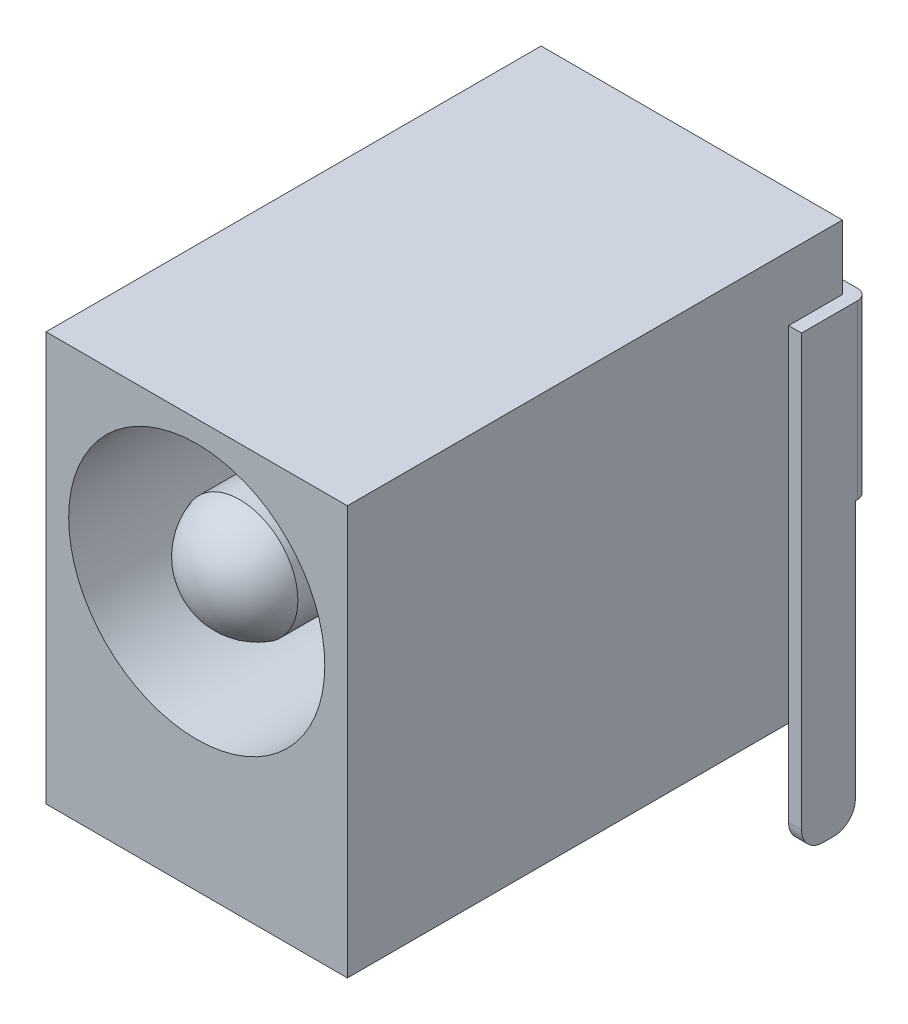
ISO-10303-21;
HEADER;
FILE_DESCRIPTION(('STEP AP214'),'2;1');
FILE_NAME('part.step','',(''),(''),'','','');
FILE_SCHEMA(('AUTOMOTIVE_DESIGN { 1 0 10303 214 1 1 1 1 }'));
ENDSEC;
DATA;
#1=APPLICATION_CONTEXT('core data for automotive mechanical design processes');
#2=APPLICATION_PROTOCOL_DEFINITION('international standard','automotive_design',2000,#1);
#3=PRODUCT_CONTEXT('',#1,'mechanical');
#4=PRODUCT('Part','Part','',(#3));
#5=PRODUCT_RELATED_PRODUCT_CATEGORY('part','',(#4));
#6=PRODUCT_DEFINITION_FORMATION('','',#4);
#7=PRODUCT_DEFINITION_CONTEXT('part definition',#1,'design');
#8=PRODUCT_DEFINITION('design','',#6,#7);
#9=PRODUCT_DEFINITION_SHAPE('','',#8);
#10=(LENGTH_UNIT() NAMED_UNIT(*) SI_UNIT(.MILLI.,.METRE.));
#11=(NAMED_UNIT(*) PLANE_ANGLE_UNIT() SI_UNIT($,.RADIAN.));
#12=(NAMED_UNIT(*) SI_UNIT($,.STERADIAN.) SOLID_ANGLE_UNIT());
#13=UNCERTAINTY_MEASURE_WITH_UNIT(LENGTH_MEASURE(1.E-05),#10,'distance_accuracy_value','');
#14=(GEOMETRIC_REPRESENTATION_CONTEXT(3) GLOBAL_UNCERTAINTY_ASSIGNED_CONTEXT((#13)) GLOBAL_UNIT_ASSIGNED_CONTEXT((#10,
#11,#12)) REPRESENTATION_CONTEXT('',''));
#15=CARTESIAN_POINT('',(0.,0.,0.));
#16=DIRECTION('',(0.,0.,1.));
#17=DIRECTION('',(1.,0.,0.));
#18=AXIS2_PLACEMENT_3D('',#15,#16,#17);
#19=CARTESIAN_POINT('',(2.875,-2.5,-8.5));
#20=DIRECTION('',(0.,0.,1.));
#21=DIRECTION('',(1.,0.,0.));
#22=AXIS2_PLACEMENT_3D('',#19,#20,#21);
#23=PLANE('',#22);
#24=CARTESIAN_POINT('',(3.375,-2.,-8.5));
#25=DIRECTION('',(0.,0.,-1.));
#26=DIRECTION('',(-1.,0.,0.));
#27=AXIS2_PLACEMENT_3D('',#24,#25,#26);
#28=CIRCLE('',#27,0.5);
#29=CARTESIAN_POINT('',(3.37500000009617,-2.5,-8.5));
#30=VERTEX_POINT('',#29);
#31=CARTESIAN_POINT('',(2.875,-2.,-8.5));
#32=VERTEX_POINT('',#31);
#33=EDGE_CURVE('P0_E82',#30,#32,#28,.T.);
#34=ORIENTED_EDGE('',*,*,#33,.T.);
#35=DIRECTION('',(0.,1.,0.));
#36=VECTOR('',#35,1.);
#37=CARTESIAN_POINT('',(2.875,-1.,-8.5));
#38=LINE('',#37,#36);
#39=CARTESIAN_POINT('',(2.875,0.,-8.5));
#40=VERTEX_POINT('',#39);
#41=EDGE_CURVE('P0_E81',#32,#40,#38,.T.);
#42=ORIENTED_EDGE('',*,*,#41,.T.);
#43=DIRECTION('',(1.,0.,0.));
#44=VECTOR('',#43,1.);
#45=CARTESIAN_POINT('',(3.5,0.,-8.5));
#46=LINE('',#45,#44);
#47=CARTESIAN_POINT('',(4.125,0.,-8.5));
#48=VERTEX_POINT('',#47);
#49=EDGE_CURVE('P0_E67',#40,#48,#46,.T.);
#50=ORIENTED_EDGE('',*,*,#49,.T.);
#51=DIRECTION('',(0.,-1.,0.));
#52=VECTOR('',#51,1.);
#53=CARTESIAN_POINT('',(4.125,-1.,-8.5));
#54=LINE('',#53,#52);
#55=CARTESIAN_POINT('',(4.125,-2.00000000010255,-8.5));
#56=VERTEX_POINT('',#55);
#57=EDGE_CURVE('P0_E62',#48,#56,#54,.T.);
#58=ORIENTED_EDGE('',*,*,#57,.T.);
#59=CARTESIAN_POINT('',(3.625,-2.,-8.5));
#60=DIRECTION('',(0.,0.,-1.));
#61=DIRECTION('',(-1.,0.,0.));
#62=AXIS2_PLACEMENT_3D('',#59,#60,#61);
#63=CIRCLE('',#62,0.5);
#64=CARTESIAN_POINT('',(3.625,-2.5,-8.5));
#65=VERTEX_POINT('',#64);
#66=EDGE_CURVE('P0_E21',#56,#65,#63,.T.);
#67=ORIENTED_EDGE('',*,*,#66,.T.);
#68=DIRECTION('',(-1.,0.,0.));
#69=VECTOR('',#68,1.);
#70=CARTESIAN_POINT('',(3.5,-2.5,-8.5));
#71=LINE('',#70,#69);
#72=EDGE_CURVE('P0_E98',#65,#30,#71,.T.);
#73=ORIENTED_EDGE('',*,*,#72,.T.);
#74=EDGE_LOOP('',(#34,#42,#50,#58,#67,#73));
#75=FACE_BOUND('',#74,.T.);
#76=ADVANCED_FACE('P0_F17',(#75),#23,.F.);
#77=CARTESIAN_POINT('',(2.875,0.,-8.2));
#78=DIRECTION('',(0.,-1.,0.));
#79=DIRECTION('',(0.,0.,-1.));
#80=AXIS2_PLACEMENT_3D('',#77,#78,#79);
#81=PLANE('',#80);
#82=DIRECTION('',(1.,0.,0.));
#83=VECTOR('',#82,1.);
#84=CARTESIAN_POINT('',(3.5,0.,-8.2));
#85=LINE('',#84,#83);
#86=CARTESIAN_POINT('',(2.875,0.,-8.2));
#87=VERTEX_POINT('',#86);
#88=CARTESIAN_POINT('',(4.125,0.,-8.2));
#89=VERTEX_POINT('',#88);
#90=EDGE_CURVE('P0_E85',#87,#89,#85,.T.);
#91=ORIENTED_EDGE('',*,*,#90,.T.);
#92=DIRECTION('',(0.,0.,-1.));
#93=VECTOR('',#92,1.);
#94=CARTESIAN_POINT('',(4.125,0.,-8.35));
#95=LINE('',#94,#93);
#96=EDGE_CURVE('P0_E78',#89,#48,#95,.T.);
#97=ORIENTED_EDGE('',*,*,#96,.T.);
#98=ORIENTED_EDGE('',*,*,#49,.F.);
#99=DIRECTION('',(0.,0.,1.));
#100=VECTOR('',#99,1.);
#101=CARTESIAN_POINT('',(2.875,0.,-8.35));
#102=LINE('',#101,#100);
#103=EDGE_CURVE('P0_E76',#40,#87,#102,.T.);
#104=ORIENTED_EDGE('',*,*,#103,.T.);
#105=EDGE_LOOP('',(#91,#97,#98,#104));
#106=FACE_BOUND('',#105,.T.);
#107=ADVANCED_FACE('P0_F75',(#106),#81,.F.);
#108=CARTESIAN_POINT('',(4.125,-2.,-8.5));
#109=DIRECTION('',(-1.,0.,0.));
#110=DIRECTION('',(0.,0.,1.));
#111=AXIS2_PLACEMENT_3D('',#108,#109,#110);
#112=PLANE('',#111);
#113=DIRECTION('',(0.,0.,1.));
#114=VECTOR('',#113,1.);
#115=CARTESIAN_POINT('',(4.125,-2.0000000002051,-8.35));
#116=LINE('',#115,#114);
#117=CARTESIAN_POINT('',(4.125,-2.00000000010255,-8.2));
#118=VERTEX_POINT('',#117);
#119=EDGE_CURVE('P0_E103',#118,#56,#116,.F.);
#120=ORIENTED_EDGE('',*,*,#119,.T.);
#121=ORIENTED_EDGE('',*,*,#57,.F.);
#122=ORIENTED_EDGE('',*,*,#96,.F.);
#123=DIRECTION('',(0.,-1.,0.));
#124=VECTOR('',#123,1.);
#125=CARTESIAN_POINT('',(4.125,-1.25,-8.2));
#126=LINE('',#125,#124);
#127=EDGE_CURVE('P0_E87',#89,#118,#126,.T.);
#128=ORIENTED_EDGE('',*,*,#127,.T.);
#129=EDGE_LOOP('',(#120,#121,#122,#128));
#130=FACE_BOUND('',#129,.T.);
#131=ADVANCED_FACE('P0_F133',(#130),#112,.F.);
#132=CARTESIAN_POINT('',(3.625,-2.,-8.2));
#133=DIRECTION('',(0.,0.,-1.));
#134=DIRECTION('',(-1.,0.,0.));
#135=AXIS2_PLACEMENT_3D('',#132,#133,#134);
#136=CYLINDRICAL_SURFACE('',#135,0.5);
#137=DIRECTION('',(0.,0.,-1.));
#138=VECTOR('',#137,1.);
#139=CARTESIAN_POINT('',(3.625,-2.5,-8.35));
#140=LINE('',#139,#138);
#141=CARTESIAN_POINT('',(3.625,-2.5,-8.2));
#142=VERTEX_POINT('',#141);
#143=EDGE_CURVE('P0_E101',#142,#65,#140,.T.);
#144=ORIENTED_EDGE('',*,*,#143,.T.);
#145=ORIENTED_EDGE('',*,*,#66,.F.);
#146=ORIENTED_EDGE('',*,*,#119,.F.);
#147=CARTESIAN_POINT('',(3.625,-2.,-8.2));
#148=DIRECTION('',(0.,0.,-1.));
#149=DIRECTION('',(-1.,0.,0.));
#150=AXIS2_PLACEMENT_3D('',#147,#148,#149);
#151=CIRCLE('',#150,0.5);
#152=EDGE_CURVE('P0_E109',#118,#142,#151,.T.);
#153=ORIENTED_EDGE('',*,*,#152,.T.);
#154=EDGE_LOOP('',(#144,#145,#146,#153));
#155=FACE_BOUND('',#154,.T.);
#156=ADVANCED_FACE('P0_F127',(#155),#136,.T.);
#157=CARTESIAN_POINT('',(3.375,-2.5,-8.5));
#158=DIRECTION('',(0.,1.,0.));
#159=DIRECTION('',(0.,0.,1.));
#160=AXIS2_PLACEMENT_3D('',#157,#158,#159);
#161=PLANE('',#160);
#162=ORIENTED_EDGE('',*,*,#72,.F.);
#163=ORIENTED_EDGE('',*,*,#143,.F.);
#164=DIRECTION('',(-1.,0.,0.));
#165=VECTOR('',#164,1.);
#166=CARTESIAN_POINT('',(3.5,-2.5,-8.2));
#167=LINE('',#166,#165);
#168=CARTESIAN_POINT('',(3.37500000009617,-2.5,-8.2));
#169=VERTEX_POINT('',#168);
#170=EDGE_CURVE('P0_E108',#142,#169,#167,.T.);
#171=ORIENTED_EDGE('',*,*,#170,.T.);
#172=DIRECTION('',(0.,0.,1.));
#173=VECTOR('',#172,1.);
#174=CARTESIAN_POINT('',(3.37500000019234,-2.5,-8.35));
#175=LINE('',#174,#173);
#176=EDGE_CURVE('P0_E100',#169,#30,#175,.F.);
#177=ORIENTED_EDGE('',*,*,#176,.T.);
#178=EDGE_LOOP('',(#162,#163,#171,#177));
#179=FACE_BOUND('',#178,.T.);
#180=ADVANCED_FACE('P0_F125',(#179),#161,.F.);
#181=CARTESIAN_POINT('',(3.375,-2.,-8.2));
#182=DIRECTION('',(0.,0.,-1.));
#183=DIRECTION('',(-1.,0.,0.));
#184=AXIS2_PLACEMENT_3D('',#181,#182,#183);
#185=CYLINDRICAL_SURFACE('',#184,0.5);
#186=ORIENTED_EDGE('',*,*,#33,.F.);
#187=ORIENTED_EDGE('',*,*,#176,.F.);
#188=CARTESIAN_POINT('',(3.375,-2.,-8.2));
#189=DIRECTION('',(0.,0.,-1.));
#190=DIRECTION('',(-1.,0.,0.));
#191=AXIS2_PLACEMENT_3D('',#188,#189,#190);
#192=CIRCLE('',#191,0.5);
#193=CARTESIAN_POINT('',(2.875,-2.,-8.2));
#194=VERTEX_POINT('',#193);
#195=EDGE_CURVE('P0_E27',#169,#194,#192,.T.);
#196=ORIENTED_EDGE('',*,*,#195,.T.);
#197=DIRECTION('',(0.,0.,-1.));
#198=VECTOR('',#197,1.);
#199=CARTESIAN_POINT('',(2.875,-2.,-8.35));
#200=LINE('',#199,#198);
#201=EDGE_CURVE('P0_E35',#194,#32,#200,.T.);
#202=ORIENTED_EDGE('',*,*,#201,.T.);
#203=EDGE_LOOP('',(#186,#187,#196,#202));
#204=FACE_BOUND('',#203,.T.);
#205=ADVANCED_FACE('P0_F143',(#204),#185,.T.);
#206=CARTESIAN_POINT('',(2.875,-2.,-8.2));
#207=DIRECTION('',(1.,0.,0.));
#208=DIRECTION('',(0.,0.,-1.));
#209=AXIS2_PLACEMENT_3D('',#206,#207,#208);
#210=PLANE('',#209);
#211=ORIENTED_EDGE('',*,*,#201,.F.);
#212=DIRECTION('',(0.,1.,0.));
#213=VECTOR('',#212,1.);
#214=CARTESIAN_POINT('',(2.875,-1.25,-8.2));
#215=LINE('',#214,#213);
#216=EDGE_CURVE('P0_E11',#194,#87,#215,.T.);
#217=ORIENTED_EDGE('',*,*,#216,.T.);
#218=ORIENTED_EDGE('',*,*,#103,.F.);
#219=ORIENTED_EDGE('',*,*,#41,.F.);
#220=EDGE_LOOP('',(#211,#217,#218,#219));
#221=FACE_BOUND('',#220,.T.);
#222=ADVANCED_FACE('P0_F80',(#221),#210,.F.);
#223=CARTESIAN_POINT('',(4.125,-2.5,-8.2));
#224=DIRECTION('',(0.,0.,-1.));
#225=DIRECTION('',(-1.,0.,0.));
#226=AXIS2_PLACEMENT_3D('',#223,#224,#225);
#227=PLANE('',#226);
#228=ORIENTED_EDGE('',*,*,#195,.F.);
#229=ORIENTED_EDGE('',*,*,#170,.F.);
#230=ORIENTED_EDGE('',*,*,#152,.F.);
#231=ORIENTED_EDGE('',*,*,#127,.F.);
#232=ORIENTED_EDGE('',*,*,#90,.F.);
#233=ORIENTED_EDGE('',*,*,#216,.F.);
#234=EDGE_LOOP('',(#228,#229,#230,#231,#232,#233));
#235=FACE_BOUND('',#234,.T.);
#236=ADVANCED_FACE('P0_F19',(#235),#227,.F.);
#237=CLOSED_SHELL('',(#76,#107,#131,#156,#180,#205,#222,#236));
#238=MANIFOLD_SOLID_BREP('P0_B1',#237);
#239=CARTESIAN_POINT('',(7.,-2.5,-11.));
#240=DIRECTION('',(0.,1.,0.));
#241=DIRECTION('',(0.,0.,1.));
#242=AXIS2_PLACEMENT_3D('',#239,#240,#241);
#243=PLANE('',#242);
#244=DIRECTION('',(-1.,0.,0.));
#245=VECTOR('',#244,1.);
#246=CARTESIAN_POINT('',(7.15,-2.5,-11.0000000001923));
#247=LINE('',#246,#245);
#248=CARTESIAN_POINT('',(7.,-2.5,-11.0000000000962));
#249=VERTEX_POINT('',#248);
#250=CARTESIAN_POINT('',(7.3,-2.5,-11.0000000000962));
#251=VERTEX_POINT('',#250);
#252=EDGE_CURVE('P1_E179',#249,#251,#247,.F.);
#253=ORIENTED_EDGE('',*,*,#252,.T.);
#254=DIRECTION('',(0.,0.,1.));
#255=VECTOR('',#254,1.);
#256=CARTESIAN_POINT('',(7.3,-2.5,-10.9));
#257=LINE('',#256,#255);
#258=CARTESIAN_POINT('',(7.3,-2.5,-10.7500000000962));
#259=VERTEX_POINT('',#258);
#260=EDGE_CURVE('P1_E165',#251,#259,#257,.T.);
#261=ORIENTED_EDGE('',*,*,#260,.T.);
#262=DIRECTION('',(1.,0.,0.));
#263=VECTOR('',#262,1.);
#264=CARTESIAN_POINT('',(7.15,-2.5,-10.7500000001923));
#265=LINE('',#264,#263);
#266=CARTESIAN_POINT('',(7.,-2.5,-10.7500000000962));
#267=VERTEX_POINT('',#266);
#268=EDGE_CURVE('P1_E220',#259,#267,#265,.F.);
#269=ORIENTED_EDGE('',*,*,#268,.T.);
#270=DIRECTION('',(0.,0.,-1.));
#271=VECTOR('',#270,1.);
#272=CARTESIAN_POINT('',(7.,-2.5,-10.875));
#273=LINE('',#272,#271);
#274=EDGE_CURVE('P1_E174',#267,#249,#273,.T.);
#275=ORIENTED_EDGE('',*,*,#274,.T.);
#276=EDGE_LOOP('',(#253,#261,#269,#275));
#277=FACE_BOUND('',#276,.T.);
#278=ADVANCED_FACE('P1_F17',(#277),#243,.F.);
#279=CARTESIAN_POINT('',(7.05,4.,-11.55));
#280=DIRECTION('',(0.,1.,0.));
#281=DIRECTION('',(0.,0.,1.));
#282=AXIS2_PLACEMENT_3D('',#279,#280,#281);
#283=CYLINDRICAL_SURFACE('',#282,0.25);
#284=DIRECTION('',(0.,-1.,0.));
#285=VECTOR('',#284,1.);
#286=CARTESIAN_POINT('',(7.3,2.75,-11.55));
#287=LINE('',#286,#285);
#288=CARTESIAN_POINT('',(7.3,8.,-11.55));
#289=VERTEX_POINT('',#288);
#290=CARTESIAN_POINT('',(7.3,4.,-11.55));
#291=VERTEX_POINT('',#290);
#292=EDGE_CURVE('P1_E143',#289,#291,#287,.T.);
#293=ORIENTED_EDGE('',*,*,#292,.T.);
#294=CARTESIAN_POINT('',(7.05,4.,-11.55));
#295=DIRECTION('',(0.,1.,0.));
#296=DIRECTION('',(0.,0.,1.));
#297=AXIS2_PLACEMENT_3D('',#294,#295,#296);
#298=CIRCLE('',#297,0.25);
#299=CARTESIAN_POINT('',(7.05,4.,-11.8));
#300=VERTEX_POINT('',#299);
#301=EDGE_CURVE('P1_E21',#300,#291,#298,.F.);
#302=ORIENTED_EDGE('',*,*,#301,.F.);
#303=DIRECTION('',(0.,-1.,0.));
#304=VECTOR('',#303,1.);
#305=CARTESIAN_POINT('',(7.05,6.,-11.8));
#306=LINE('',#305,#304);
#307=CARTESIAN_POINT('',(7.05,8.,-11.8));
#308=VERTEX_POINT('',#307);
#309=EDGE_CURVE('P1_E218',#308,#300,#306,.T.);
#310=ORIENTED_EDGE('',*,*,#309,.F.);
#311=CARTESIAN_POINT('',(7.05,8.,-11.55));
#312=DIRECTION('',(0.,1.,0.));
#313=DIRECTION('',(0.,0.,1.));
#314=AXIS2_PLACEMENT_3D('',#311,#312,#313);
#315=CIRCLE('',#314,0.25);
#316=EDGE_CURVE('P1_E141',#289,#308,#315,.T.);
#317=ORIENTED_EDGE('',*,*,#316,.F.);
#318=EDGE_LOOP('',(#293,#302,#310,#317));
#319=FACE_BOUND('',#318,.T.);
#320=ADVANCED_FACE('P1_F144',(#319),#283,.T.);
#321=CARTESIAN_POINT('',(7.05,4.,-11.8));
#322=DIRECTION('',(0.,0.,-1.));
#323=DIRECTION('',(-1.,0.,0.));
#324=AXIS2_PLACEMENT_3D('',#321,#322,#323);
#325=PLANE('',#324);
#326=DIRECTION('',(0.,1.,0.));
#327=VECTOR('',#326,1.);
#328=CARTESIAN_POINT('',(2.3,6.,-11.8));
#329=LINE('',#328,#327);
#330=CARTESIAN_POINT('',(2.3,4.5,-11.8));
#331=VERTEX_POINT('',#330);
#332=CARTESIAN_POINT('',(2.3,7.49999999989745,-11.8));
#333=VERTEX_POINT('',#332);
#334=EDGE_CURVE('P1_E221',#331,#333,#329,.T.);
#335=ORIENTED_EDGE('',*,*,#334,.T.);
#336=CARTESIAN_POINT('',(2.8,7.5,-11.8));
#337=DIRECTION('',(0.,0.,1.));
#338=DIRECTION('',(1.,0.,0.));
#339=AXIS2_PLACEMENT_3D('',#336,#337,#338);
#340=CIRCLE('',#339,0.5);
#341=CARTESIAN_POINT('',(2.8,8.,-11.8));
#342=VERTEX_POINT('',#341);
#343=EDGE_CURVE('P1_E243',#333,#342,#340,.F.);
#344=ORIENTED_EDGE('',*,*,#343,.T.);
#345=DIRECTION('',(1.,0.,0.));
#346=VECTOR('',#345,1.);
#347=CARTESIAN_POINT('',(5.05,8.,-11.8));
#348=LINE('',#347,#346);
#349=EDGE_CURVE('P1_E259',#342,#308,#348,.T.);
#350=ORIENTED_EDGE('',*,*,#349,.T.);
#351=ORIENTED_EDGE('',*,*,#309,.T.);
#352=DIRECTION('',(-1.,0.,0.));
#353=VECTOR('',#352,1.);
#354=CARTESIAN_POINT('',(5.05,4.,-11.8));
#355=LINE('',#354,#353);
#356=CARTESIAN_POINT('',(2.79999999990383,4.,-11.8));
#357=VERTEX_POINT('',#356);
#358=EDGE_CURVE('P1_E140',#300,#357,#355,.T.);
#359=ORIENTED_EDGE('',*,*,#358,.T.);
#360=CARTESIAN_POINT('',(2.8,4.5,-11.8));
#361=DIRECTION('',(0.,0.,1.));
#362=DIRECTION('',(1.,0.,0.));
#363=AXIS2_PLACEMENT_3D('',#360,#361,#362);
#364=CIRCLE('',#363,0.5);
#365=EDGE_CURVE('P1_E246',#357,#331,#364,.F.);
#366=ORIENTED_EDGE('',*,*,#365,.T.);
#367=EDGE_LOOP('',(#335,#344,#350,#351,#359,#366));
#368=FACE_BOUND('',#367,.T.);
#369=ADVANCED_FACE('P1_F261',(#368),#325,.T.);
#370=CARTESIAN_POINT('',(7.3,-2.,-10.75));
#371=DIRECTION('',(-1.,0.,0.));
#372=DIRECTION('',(0.,0.,1.));
#373=AXIS2_PLACEMENT_3D('',#370,#371,#372);
#374=CYLINDRICAL_SURFACE('',#373,0.5);
#375=ORIENTED_EDGE('',*,*,#268,.F.);
#376=CARTESIAN_POINT('',(7.3,-2.,-10.75));
#377=DIRECTION('',(-1.,0.,0.));
#378=DIRECTION('',(0.,0.,1.));
#379=AXIS2_PLACEMENT_3D('',#376,#377,#378);
#380=CIRCLE('',#379,0.5);
#381=CARTESIAN_POINT('',(7.3,-2.,-10.25));
#382=VERTEX_POINT('',#381);
#383=EDGE_CURVE('P1_E147',#259,#382,#380,.T.);
#384=ORIENTED_EDGE('',*,*,#383,.T.);
#385=DIRECTION('',(-1.,0.,0.));
#386=VECTOR('',#385,1.);
#387=CARTESIAN_POINT('',(7.15,-2.,-10.25));
#388=LINE('',#387,#386);
#389=CARTESIAN_POINT('',(7.,-2.,-10.25));
#390=VERTEX_POINT('',#389);
#391=EDGE_CURVE('P1_E189',#382,#390,#388,.T.);
#392=ORIENTED_EDGE('',*,*,#391,.T.);
#393=CARTESIAN_POINT('',(7.,-2.,-10.75));
#394=DIRECTION('',(-1.,0.,0.));
#395=DIRECTION('',(0.,0.,1.));
#396=AXIS2_PLACEMENT_3D('',#393,#394,#395);
#397=CIRCLE('',#396,0.5);
#398=EDGE_CURVE('P1_E177',#390,#267,#397,.F.);
#399=ORIENTED_EDGE('',*,*,#398,.T.);
#400=EDGE_LOOP('',(#375,#384,#392,#399));
#401=FACE_BOUND('',#400,.T.);
#402=ADVANCED_FACE('P1_F349',(#401),#374,.T.);
#403=CARTESIAN_POINT('',(7.,-2.5,-10.25));
#404=DIRECTION('',(1.,0.,0.));
#405=DIRECTION('',(0.,0.,-1.));
#406=AXIS2_PLACEMENT_3D('',#403,#404,#405);
#407=PLANE('',#406);
#408=DIRECTION('',(0.,-1.,0.));
#409=VECTOR('',#408,1.);
#410=CARTESIAN_POINT('',(7.000000003,3.75,-11.5));
#411=LINE('',#410,#409);
#412=CARTESIAN_POINT('',(7.000000002,-9.16666626863775E-10,-11.5));
#413=VERTEX_POINT('',#412);
#414=CARTESIAN_POINT('',(7.0000000015,-2.,-11.5));
#415=VERTEX_POINT('',#414);
#416=EDGE_CURVE('P1_E169',#413,#415,#411,.T.);
#417=ORIENTED_EDGE('',*,*,#416,.T.);
#418=CARTESIAN_POINT('',(7.,-2.,-11.));
#419=DIRECTION('',(-1.,0.,0.));
#420=DIRECTION('',(0.,0.,1.));
#421=AXIS2_PLACEMENT_3D('',#418,#419,#420);
#422=CIRCLE('',#421,0.499999999999999);
#423=EDGE_CURVE('P1_E227',#415,#249,#422,.T.);
#424=ORIENTED_EDGE('',*,*,#423,.T.);
#425=ORIENTED_EDGE('',*,*,#274,.F.);
#426=ORIENTED_EDGE('',*,*,#398,.F.);
#427=DIRECTION('',(0.,1.,0.));
#428=VECTOR('',#427,1.);
#429=CARTESIAN_POINT('',(7.,3.,-10.25));
#430=LINE('',#429,#428);
#431=CARTESIAN_POINT('',(7.,0.,-10.2500000005833));
#432=VERTEX_POINT('',#431);
#433=EDGE_CURVE('P1_E171',#390,#432,#430,.T.);
#434=ORIENTED_EDGE('',*,*,#433,.T.);
#435=DIRECTION('',(0.,0.,1.));
#436=VECTOR('',#435,1.);
#437=CARTESIAN_POINT('',(7.,0.,-10.875));
#438=LINE('',#437,#436);
#439=EDGE_CURVE('P1_E176',#413,#432,#438,.T.);
#440=ORIENTED_EDGE('',*,*,#439,.F.);
#441=EDGE_LOOP('',(#417,#424,#425,#426,#434,#440));
#442=FACE_BOUND('',#441,.T.);
#443=ADVANCED_FACE('P1_F347',(#442),#407,.F.);
#444=CARTESIAN_POINT('',(7.3,-2.,-11.));
#445=DIRECTION('',(-1.,0.,0.));
#446=DIRECTION('',(0.,0.,1.));
#447=AXIS2_PLACEMENT_3D('',#444,#445,#446);
#448=CYLINDRICAL_SURFACE('',#447,0.499999999999999);
#449=DIRECTION('',(1.,0.,0.));
#450=VECTOR('',#449,1.);
#451=CARTESIAN_POINT('',(3.65,-2.,-11.5));
#452=LINE('',#451,#450);
#453=CARTESIAN_POINT('',(7.3,-2.,-11.5));
#454=VERTEX_POINT('',#453);
#455=EDGE_CURVE('P1_E162',#415,#454,#452,.T.);
#456=ORIENTED_EDGE('',*,*,#455,.T.);
#457=CARTESIAN_POINT('',(7.3,-2.,-11.));
#458=DIRECTION('',(-1.,0.,0.));
#459=DIRECTION('',(0.,0.,1.));
#460=AXIS2_PLACEMENT_3D('',#457,#458,#459);
#461=CIRCLE('',#460,0.499999999999999);
#462=EDGE_CURVE('P1_E167',#454,#251,#461,.T.);
#463=ORIENTED_EDGE('',*,*,#462,.T.);
#464=ORIENTED_EDGE('',*,*,#252,.F.);
#465=ORIENTED_EDGE('',*,*,#423,.F.);
#466=EDGE_LOOP('',(#456,#463,#464,#465));
#467=FACE_BOUND('',#466,.T.);
#468=ADVANCED_FACE('P1_F344',(#467),#448,.T.);
#469=CARTESIAN_POINT('',(7.3,-2.5,-11.55));
#470=DIRECTION('',(-1.,0.,0.));
#471=DIRECTION('',(0.,0.,1.));
#472=AXIS2_PLACEMENT_3D('',#469,#470,#471);
#473=PLANE('',#472);
#474=ORIENTED_EDGE('',*,*,#292,.F.);
#475=DIRECTION('',(0.,0.,1.));
#476=VECTOR('',#475,1.);
#477=CARTESIAN_POINT('',(7.3,8.,-11.025));
#478=LINE('',#477,#476);
#479=CARTESIAN_POINT('',(7.3,8.,-10.25));
#480=VERTEX_POINT('',#479);
#481=EDGE_CURVE('P1_E215',#289,#480,#478,.T.);
#482=ORIENTED_EDGE('',*,*,#481,.T.);
#483=DIRECTION('',(0.,-1.,0.));
#484=VECTOR('',#483,1.);
#485=CARTESIAN_POINT('',(7.3,3.,-10.25));
#486=LINE('',#485,#484);
#487=EDGE_CURVE('P1_E191',#480,#382,#486,.T.);
#488=ORIENTED_EDGE('',*,*,#487,.T.);
#489=ORIENTED_EDGE('',*,*,#383,.F.);
#490=ORIENTED_EDGE('',*,*,#260,.F.);
#491=ORIENTED_EDGE('',*,*,#462,.F.);
#492=DIRECTION('',(0.,1.,0.));
#493=VECTOR('',#492,1.);
#494=CARTESIAN_POINT('',(7.3,3.75,-11.5));
#495=LINE('',#494,#493);
#496=CARTESIAN_POINT('',(7.3,3.9999999975,-11.5));
#497=VERTEX_POINT('',#496);
#498=EDGE_CURVE('P1_E152',#454,#497,#495,.T.);
#499=ORIENTED_EDGE('',*,*,#498,.T.);
#500=DIRECTION('',(0.,0.,-1.));
#501=VECTOR('',#500,1.);
#502=CARTESIAN_POINT('',(7.3,4.,-11.65));
#503=LINE('',#502,#501);
#504=EDGE_CURVE('P1_E137',#497,#291,#503,.T.);
#505=ORIENTED_EDGE('',*,*,#504,.T.);
#506=EDGE_LOOP('',(#474,#482,#488,#489,#490,#491,#499,#505));
#507=FACE_BOUND('',#506,.T.);
#508=ADVANCED_FACE('P1_F149',(#507),#473,.F.);
#509=CARTESIAN_POINT('',(2.8,4.,-11.8));
#510=DIRECTION('',(0.,1.,0.));
#511=DIRECTION('',(0.,0.,1.));
#512=AXIS2_PLACEMENT_3D('',#509,#510,#511);
#513=PLANE('',#512);
#514=ORIENTED_EDGE('',*,*,#301,.T.);
#515=ORIENTED_EDGE('',*,*,#504,.F.);
#516=DIRECTION('',(-1.,0.,0.));
#517=VECTOR('',#516,1.);
#518=CARTESIAN_POINT('',(3.65,3.999999995,-11.5));
#519=LINE('',#518,#517);
#520=CARTESIAN_POINT('',(2.79999999990383,3.9999999975,-11.5));
#521=VERTEX_POINT('',#520);
#522=EDGE_CURVE('P1_E161',#497,#521,#519,.T.);
#523=ORIENTED_EDGE('',*,*,#522,.T.);
#524=DIRECTION('',(0.,0.,1.));
#525=VECTOR('',#524,1.);
#526=CARTESIAN_POINT('',(2.79999999980765,4.,-11.65));
#527=LINE('',#526,#525);
#528=EDGE_CURVE('P1_E154',#521,#357,#527,.F.);
#529=ORIENTED_EDGE('',*,*,#528,.T.);
#530=ORIENTED_EDGE('',*,*,#358,.F.);
#531=EDGE_LOOP('',(#514,#515,#523,#529,#530));
#532=FACE_BOUND('',#531,.T.);
#533=ADVANCED_FACE('P1_F135',(#532),#513,.F.);
#534=CARTESIAN_POINT('',(2.8,4.5,-11.8));
#535=DIRECTION('',(0.,0.,1.));
#536=DIRECTION('',(1.,0.,0.));
#537=AXIS2_PLACEMENT_3D('',#534,#535,#536);
#538=CYLINDRICAL_SURFACE('',#537,0.5);
#539=DIRECTION('',(0.,0.,-1.));
#540=VECTOR('',#539,1.);
#541=CARTESIAN_POINT('',(2.3,4.5,-11.65));
#542=LINE('',#541,#540);
#543=CARTESIAN_POINT('',(2.29999999945,4.5,-11.5));
#544=VERTEX_POINT('',#543);
#545=EDGE_CURVE('P1_E224',#544,#331,#542,.T.);
#546=ORIENTED_EDGE('',*,*,#545,.T.);
#547=ORIENTED_EDGE('',*,*,#365,.F.);
#548=ORIENTED_EDGE('',*,*,#528,.F.);
#549=CARTESIAN_POINT('',(2.8,4.5,-11.5));
#550=DIRECTION('',(0.,0.,1.));
#551=DIRECTION('',(1.,0.,0.));
#552=AXIS2_PLACEMENT_3D('',#549,#550,#551);
#553=CIRCLE('',#552,0.5);
#554=EDGE_CURVE('P1_E241',#521,#544,#553,.F.);
#555=ORIENTED_EDGE('',*,*,#554,.T.);
#556=EDGE_LOOP('',(#546,#547,#548,#555));
#557=FACE_BOUND('',#556,.T.);
#558=ADVANCED_FACE('P1_F286',(#557),#538,.T.);
#559=CARTESIAN_POINT('',(2.3,4.5,-11.5));
#560=DIRECTION('',(1.,0.,0.));
#561=DIRECTION('',(0.,0.,-1.));
#562=AXIS2_PLACEMENT_3D('',#559,#560,#561);
#563=PLANE('',#562);
#564=DIRECTION('',(0.,0.,1.));
#565=VECTOR('',#564,1.);
#566=CARTESIAN_POINT('',(2.3,7.4999999997949,-11.65));
#567=LINE('',#566,#565);
#568=CARTESIAN_POINT('',(2.29999999945,7.49999999989745,-11.5));
#569=VERTEX_POINT('',#568);
#570=EDGE_CURVE('P1_E223',#569,#333,#567,.F.);
#571=ORIENTED_EDGE('',*,*,#570,.T.);
#572=ORIENTED_EDGE('',*,*,#334,.F.);
#573=ORIENTED_EDGE('',*,*,#545,.F.);
#574=DIRECTION('',(0.,1.,0.));
#575=VECTOR('',#574,1.);
#576=CARTESIAN_POINT('',(2.2999999989,3.75,-11.5));
#577=LINE('',#576,#575);
#578=EDGE_CURVE('P1_E240',#544,#569,#577,.T.);
#579=ORIENTED_EDGE('',*,*,#578,.T.);
#580=EDGE_LOOP('',(#571,#572,#573,#579));
#581=FACE_BOUND('',#580,.T.);
#582=ADVANCED_FACE('P1_F291',(#581),#563,.F.);
#583=CARTESIAN_POINT('',(2.8,7.5,-11.8));
#584=DIRECTION('',(0.,0.,1.));
#585=DIRECTION('',(1.,0.,0.));
#586=AXIS2_PLACEMENT_3D('',#583,#584,#585);
#587=CYLINDRICAL_SURFACE('',#586,0.5);
#588=DIRECTION('',(0.,0.,-1.));
#589=VECTOR('',#588,1.);
#590=CARTESIAN_POINT('',(2.8,8.,-11.025));
#591=LINE('',#590,#589);
#592=CARTESIAN_POINT('',(2.8,7.99999999775,-11.5));
#593=VERTEX_POINT('',#592);
#594=EDGE_CURVE('P1_E264',#593,#342,#591,.T.);
#595=ORIENTED_EDGE('',*,*,#594,.T.);
#596=ORIENTED_EDGE('',*,*,#343,.F.);
#597=ORIENTED_EDGE('',*,*,#570,.F.);
#598=CARTESIAN_POINT('',(2.8,7.5,-11.5));
#599=DIRECTION('',(0.,0.,1.));
#600=DIRECTION('',(1.,0.,0.));
#601=AXIS2_PLACEMENT_3D('',#598,#599,#600);
#602=CIRCLE('',#601,0.5);
#603=EDGE_CURVE('P1_E237',#569,#593,#602,.F.);
#604=ORIENTED_EDGE('',*,*,#603,.T.);
#605=EDGE_LOOP('',(#595,#596,#597,#604));
#606=FACE_BOUND('',#605,.T.);
#607=ADVANCED_FACE('P1_F295',(#606),#587,.T.);
#608=CARTESIAN_POINT('',(2.8,8.,-10.25));
#609=DIRECTION('',(0.,-1.,0.));
#610=DIRECTION('',(0.,0.,-1.));
#611=AXIS2_PLACEMENT_3D('',#608,#609,#610);
#612=PLANE('',#611);
#613=ORIENTED_EDGE('',*,*,#316,.T.);
#614=ORIENTED_EDGE('',*,*,#349,.F.);
#615=ORIENTED_EDGE('',*,*,#594,.F.);
#616=DIRECTION('',(1.,0.,0.));
#617=VECTOR('',#616,1.);
#618=CARTESIAN_POINT('',(3.65,7.9999999955,-11.5));
#619=LINE('',#618,#617);
#620=CARTESIAN_POINT('',(7.0000000005,7.999999997,-11.5));
#621=VERTEX_POINT('',#620);
#622=EDGE_CURVE('P1_E239',#593,#621,#619,.T.);
#623=ORIENTED_EDGE('',*,*,#622,.T.);
#624=DIRECTION('',(0.,0.,-1.));
#625=VECTOR('',#624,1.);
#626=CARTESIAN_POINT('',(6.9999999985,8.,-11.025));
#627=LINE('',#626,#625);
#628=CARTESIAN_POINT('',(6.9999999995,7.99999999975,-10.2500000006667));
#629=VERTEX_POINT('',#628);
#630=EDGE_CURVE('P1_E245',#629,#621,#627,.T.);
#631=ORIENTED_EDGE('',*,*,#630,.F.);
#632=DIRECTION('',(1.,0.,0.));
#633=VECTOR('',#632,1.);
#634=CARTESIAN_POINT('',(7.15,8.,-10.25));
#635=LINE('',#634,#633);
#636=EDGE_CURVE('P1_E210',#629,#480,#635,.T.);
#637=ORIENTED_EDGE('',*,*,#636,.T.);
#638=ORIENTED_EDGE('',*,*,#481,.F.);
#639=EDGE_LOOP('',(#613,#614,#615,#623,#631,#637,#638));
#640=FACE_BOUND('',#639,.T.);
#641=ADVANCED_FACE('P1_F256',(#640),#612,.F.);
#642=CARTESIAN_POINT('',(7.,-2.,-10.25));
#643=DIRECTION('',(0.,0.,-1.));
#644=DIRECTION('',(0.,1.,0.));
#645=AXIS2_PLACEMENT_3D('',#642,#643,#644);
#646=PLANE('',#645);
#647=ORIENTED_EDGE('',*,*,#433,.F.);
#648=ORIENTED_EDGE('',*,*,#391,.F.);
#649=ORIENTED_EDGE('',*,*,#487,.F.);
#650=ORIENTED_EDGE('',*,*,#636,.F.);
#651=DIRECTION('',(0.,-1.,0.));
#652=VECTOR('',#651,1.);
#653=CARTESIAN_POINT('',(7.,4.75,-10.250000002));
#654=LINE('',#653,#652);
#655=EDGE_CURVE('P1_E196',#629,#432,#654,.T.);
#656=ORIENTED_EDGE('',*,*,#655,.T.);
#657=EDGE_LOOP('',(#647,#648,#649,#650,#656));
#658=FACE_BOUND('',#657,.T.);
#659=ADVANCED_FACE('P1_F371',(#658),#646,.F.);
#660=CARTESIAN_POINT('',(0.,-2.,-11.5));
#661=DIRECTION('',(0.,0.,1.));
#662=DIRECTION('',(1.,0.,0.));
#663=AXIS2_PLACEMENT_3D('',#660,#661,#662);
#664=PLANE('',#663);
#665=ORIENTED_EDGE('',*,*,#603,.F.);
#666=ORIENTED_EDGE('',*,*,#578,.F.);
#667=ORIENTED_EDGE('',*,*,#554,.F.);
#668=ORIENTED_EDGE('',*,*,#522,.F.);
#669=ORIENTED_EDGE('',*,*,#498,.F.);
#670=ORIENTED_EDGE('',*,*,#455,.F.);
#671=ORIENTED_EDGE('',*,*,#416,.F.);
#672=DIRECTION('',(1.,0.,0.));
#673=VECTOR('',#672,1.);
#674=CARTESIAN_POINT('',(3.5,0.,-11.5));
#675=LINE('',#674,#673);
#676=CARTESIAN_POINT('',(0.,-1.37500004871588E-09,-11.5));
#677=VERTEX_POINT('',#676);
#678=EDGE_CURVE('P1_E182',#677,#413,#675,.T.);
#679=ORIENTED_EDGE('',*,*,#678,.F.);
#680=DIRECTION('',(0.,1.,0.));
#681=VECTOR('',#680,1.);
#682=CARTESIAN_POINT('',(0.,4.75,-11.5));
#683=LINE('',#682,#681);
#684=CARTESIAN_POINT('',(0.,9.5,-11.5));
#685=VERTEX_POINT('',#684);
#686=EDGE_CURVE('P1_E301',#677,#685,#683,.T.);
#687=ORIENTED_EDGE('',*,*,#686,.T.);
#688=DIRECTION('',(1.,0.,0.));
#689=VECTOR('',#688,1.);
#690=CARTESIAN_POINT('',(3.5,9.5,-11.5));
#691=LINE('',#690,#689);
#692=CARTESIAN_POINT('',(7.00000000075,9.5,-11.5));
#693=VERTEX_POINT('',#692);
#694=EDGE_CURVE('P1_E303',#685,#693,#691,.T.);
#695=ORIENTED_EDGE('',*,*,#694,.T.);
#696=DIRECTION('',(0.,-1.,0.));
#697=VECTOR('',#696,1.);
#698=CARTESIAN_POINT('',(7.,4.75,-11.5));
#699=LINE('',#698,#697);
#700=EDGE_CURVE('P1_E274',#693,#621,#699,.T.);
#701=ORIENTED_EDGE('',*,*,#700,.T.);
#702=ORIENTED_EDGE('',*,*,#622,.F.);
#703=EDGE_LOOP('',(#665,#666,#667,#668,#669,#670,#671,#679,#687,#695,#701,#702));
#704=FACE_BOUND('',#703,.T.);
#705=ADVANCED_FACE('P1_F299',(#704),#664,.F.);
#706=CARTESIAN_POINT('',(0.,0.,0.));
#707=DIRECTION('',(1.,0.,0.));
#708=DIRECTION('',(0.,0.,-1.));
#709=AXIS2_PLACEMENT_3D('',#706,#707,#708);
#710=PLANE('',#709);
#711=DIRECTION('',(0.,1.,0.));
#712=VECTOR('',#711,1.);
#713=CARTESIAN_POINT('',(0.,4.75,0.));
#714=LINE('',#713,#712);
#715=CARTESIAN_POINT('',(0.,0.,0.));
#716=VERTEX_POINT('',#715);
#717=CARTESIAN_POINT('',(0.,9.5,0.));
#718=VERTEX_POINT('',#717);
#719=EDGE_CURVE('P1_E205',#716,#718,#714,.T.);
#720=ORIENTED_EDGE('',*,*,#719,.T.);
#721=DIRECTION('',(0.,0.,-1.));
#722=VECTOR('',#721,1.);
#723=CARTESIAN_POINT('',(0.,9.5,-5.75));
#724=LINE('',#723,#722);
#725=EDGE_CURVE('P1_E200',#718,#685,#724,.T.);
#726=ORIENTED_EDGE('',*,*,#725,.T.);
#727=ORIENTED_EDGE('',*,*,#686,.F.);
#728=DIRECTION('',(0.,0.,-1.));
#729=VECTOR('',#728,1.);
#730=CARTESIAN_POINT('',(0.,0.,-5.75));
#731=LINE('',#730,#729);
#732=EDGE_CURVE('P1_E186',#716,#677,#731,.T.);
#733=ORIENTED_EDGE('',*,*,#732,.F.);
#734=EDGE_LOOP('',(#720,#726,#727,#733));
#735=FACE_BOUND('',#734,.T.);
#736=ADVANCED_FACE('P1_F377',(#735),#710,.F.);
#737=CARTESIAN_POINT('',(0.,9.5,0.));
#738=DIRECTION('',(0.,-1.,0.));
#739=DIRECTION('',(0.,0.,-1.));
#740=AXIS2_PLACEMENT_3D('',#737,#738,#739);
#741=PLANE('',#740);
#742=DIRECTION('',(1.,0.,0.));
#743=VECTOR('',#742,1.);
#744=CARTESIAN_POINT('',(3.5,9.5,0.));
#745=LINE('',#744,#743);
#746=CARTESIAN_POINT('',(7.,9.5,0.));
#747=VERTEX_POINT('',#746);
#748=EDGE_CURVE('P1_E320',#718,#747,#745,.T.);
#749=ORIENTED_EDGE('',*,*,#748,.T.);
#750=DIRECTION('',(0.,0.,-1.));
#751=VECTOR('',#750,1.);
#752=CARTESIAN_POINT('',(7.,9.5,-5.75));
#753=LINE('',#752,#751);
#754=EDGE_CURVE('P1_E199',#747,#693,#753,.T.);
#755=ORIENTED_EDGE('',*,*,#754,.T.);
#756=ORIENTED_EDGE('',*,*,#694,.F.);
#757=ORIENTED_EDGE('',*,*,#725,.F.);
#758=EDGE_LOOP('',(#749,#755,#756,#757));
#759=FACE_BOUND('',#758,.T.);
#760=ADVANCED_FACE('P1_F380',(#759),#741,.F.);
#761=CARTESIAN_POINT('',(7.,0.,-11.5));
#762=DIRECTION('',(-1.,0.,0.));
#763=DIRECTION('',(0.,0.,1.));
#764=AXIS2_PLACEMENT_3D('',#761,#762,#763);
#765=PLANE('',#764);
#766=ORIENTED_EDGE('',*,*,#700,.F.);
#767=ORIENTED_EDGE('',*,*,#754,.F.);
#768=DIRECTION('',(0.,-1.,0.));
#769=VECTOR('',#768,1.);
#770=CARTESIAN_POINT('',(7.,4.75,0.));
#771=LINE('',#770,#769);
#772=CARTESIAN_POINT('',(7.,0.,0.));
#773=VERTEX_POINT('',#772);
#774=EDGE_CURVE('P1_E322',#747,#773,#771,.T.);
#775=ORIENTED_EDGE('',*,*,#774,.T.);
#776=DIRECTION('',(0.,0.,1.));
#777=VECTOR('',#776,1.);
#778=CARTESIAN_POINT('',(7.,0.,-5.75));
#779=LINE('',#778,#777);
#780=EDGE_CURVE('P1_E185',#432,#773,#779,.T.);
#781=ORIENTED_EDGE('',*,*,#780,.F.);
#782=ORIENTED_EDGE('',*,*,#655,.F.);
#783=ORIENTED_EDGE('',*,*,#630,.T.);
#784=EDGE_LOOP('',(#766,#767,#775,#781,#782,#783));
#785=FACE_BOUND('',#784,.T.);
#786=ADVANCED_FACE('P1_F384',(#785),#765,.F.);
#787=CARTESIAN_POINT('',(0.,0.,0.));
#788=DIRECTION('',(0.,-1.,0.));
#789=DIRECTION('',(0.,0.,-1.));
#790=AXIS2_PLACEMENT_3D('',#787,#788,#789);
#791=PLANE('',#790);
#792=ORIENTED_EDGE('',*,*,#780,.T.);
#793=DIRECTION('',(-1.,0.,0.));
#794=VECTOR('',#793,1.);
#795=CARTESIAN_POINT('',(3.5,0.,0.));
#796=LINE('',#795,#794);
#797=EDGE_CURVE('P1_E236',#773,#716,#796,.T.);
#798=ORIENTED_EDGE('',*,*,#797,.T.);
#799=ORIENTED_EDGE('',*,*,#732,.T.);
#800=ORIENTED_EDGE('',*,*,#678,.T.);
#801=ORIENTED_EDGE('',*,*,#439,.T.);
#802=EDGE_LOOP('',(#792,#798,#799,#800,#801));
#803=FACE_BOUND('',#802,.T.);
#804=ADVANCED_FACE('P1_F388',(#803),#791,.T.);
#805=CARTESIAN_POINT('',(7.,0.,0.));
#806=DIRECTION('',(0.,0.,-1.));
#807=DIRECTION('',(-1.,0.,0.));
#808=AXIS2_PLACEMENT_3D('',#805,#806,#807);
#809=PLANE('',#808);
#810=CARTESIAN_POINT('',(3.5,6.025,0.));
#811=DIRECTION('',(0.,0.,1.));
#812=DIRECTION('',(0.,-1.,0.));
#813=AXIS2_PLACEMENT_3D('',#810,#811,#812);
#814=CIRCLE('',#813,2.975);
#815=CARTESIAN_POINT('',(3.5,3.05,0.));
#816=VERTEX_POINT('',#815);
#817=EDGE_CURVE('P1_E233',#816,#816,#814,.T.);
#818=ORIENTED_EDGE('',*,*,#817,.F.);
#819=EDGE_LOOP('',(#818));
#820=FACE_BOUND('',#819,.T.);
#821=ORIENTED_EDGE('',*,*,#774,.F.);
#822=ORIENTED_EDGE('',*,*,#748,.F.);
#823=ORIENTED_EDGE('',*,*,#719,.F.);
#824=ORIENTED_EDGE('',*,*,#797,.F.);
#825=EDGE_LOOP('',(#821,#822,#823,#824));
#826=FACE_BOUND('',#825,.T.);
#827=ADVANCED_FACE('P1_F338',(#820,#826),#809,.F.);
#828=CARTESIAN_POINT('',(3.5,6.025,-10.));
#829=DIRECTION('',(0.,0.,1.));
#830=DIRECTION('',(0.,-1.,0.));
#831=AXIS2_PLACEMENT_3D('',#828,#829,#830);
#832=CYLINDRICAL_SURFACE('',#831,2.975);
#833=ORIENTED_EDGE('',*,*,#817,.T.);
#834=EDGE_LOOP('',(#833));
#835=FACE_BOUND('',#834,.T.);
#836=CARTESIAN_POINT('',(3.5,6.025,-10.));
#837=DIRECTION('',(0.,0.,1.));
#838=DIRECTION('',(0.,-1.,0.));
#839=AXIS2_PLACEMENT_3D('',#836,#837,#838);
#840=CIRCLE('',#839,2.975);
#841=CARTESIAN_POINT('',(3.5,3.05,-10.));
#842=VERTEX_POINT('',#841);
#843=EDGE_CURVE('P1_E230',#842,#842,#840,.T.);
#844=ORIENTED_EDGE('',*,*,#843,.F.);
#845=EDGE_LOOP('',(#844));
#846=FACE_BOUND('',#845,.T.);
#847=ADVANCED_FACE('P1_F335',(#835,#846),#832,.F.);
#848=CARTESIAN_POINT('',(0.4893,3.0143,-10.));
#849=DIRECTION('',(0.,0.,1.));
#850=DIRECTION('',(1.,0.,0.));
#851=AXIS2_PLACEMENT_3D('',#848,#849,#850);
#852=PLANE('',#851);
#853=CARTESIAN_POINT('',(3.5,6.025,-10.));
#854=DIRECTION('',(0.,0.,-1.));
#855=DIRECTION('',(-1.,0.,0.));
#856=AXIS2_PLACEMENT_3D('',#853,#854,#855);
#857=CIRCLE('',#856,1.35);
#858=CARTESIAN_POINT('',(2.15,6.025,-10.));
#859=VERTEX_POINT('',#858);
#860=EDGE_CURVE('P1_E27',#859,#859,#857,.T.);
#861=ORIENTED_EDGE('',*,*,#860,.T.);
#862=EDGE_LOOP('',(#861));
#863=FACE_BOUND('',#862,.T.);
#864=ORIENTED_EDGE('',*,*,#843,.T.);
#865=EDGE_LOOP('',(#864));
#866=FACE_BOUND('',#865,.T.);
#867=ADVANCED_FACE('P1_F19',(#863,#866),#852,.T.);
#868=CARTESIAN_POINT('',(3.5,6.025,-1.));
#869=DIRECTION('',(0.,0.,-1.));
#870=DIRECTION('',(-1.,0.,0.));
#871=AXIS2_PLACEMENT_3D('',#868,#869,#870);
#872=CYLINDRICAL_SURFACE('',#871,1.35);
#873=ORIENTED_EDGE('',*,*,#860,.F.);
#874=EDGE_LOOP('',(#873));
#875=FACE_BOUND('',#874,.T.);
#876=CARTESIAN_POINT('',(3.5,6.025,-1.00000001392174));
#877=DIRECTION('',(0.,0.,1.));
#878=DIRECTION('',(1.,0.,0.));
#879=AXIS2_PLACEMENT_3D('',#876,#877,#878);
#880=CIRCLE('',#879,1.35000000424097);
#881=CARTESIAN_POINT('',(4.85000000424097,6.025,-1.00000001392174));
#882=VERTEX_POINT('',#881);
#883=EDGE_CURVE('P1_E11',#882,#882,#880,.F.);
#884=ORIENTED_EDGE('',*,*,#883,.T.);
#885=EDGE_LOOP('',(#884));
#886=FACE_BOUND('',#885,.T.);
#887=ADVANCED_FACE('P1_F331',(#875,#886),#872,.T.);
#888=CARTESIAN_POINT('',(3.5,6.025,-1.41125000000001));
#889=DIRECTION('',(0.,0.,1.));
#890=DIRECTION('',(-1.,0.,0.));
#891=AXIS2_PLACEMENT_3D('',#888,#889,#890);
#892=SPHERICAL_SURFACE('',#891,1.41125);
#893=CARTESIAN_POINT('',(3.5,6.025,0.));
#894=VERTEX_POINT('',#893);
#895=VERTEX_LOOP('',#894);
#896=FACE_BOUND('',#895,.T.);
#897=ORIENTED_EDGE('',*,*,#883,.F.);
#898=EDGE_LOOP('',(#897));
#899=FACE_BOUND('',#898,.T.);
#900=ADVANCED_FACE('P1_F328',(#896,#899),#892,.T.);
#901=CLOSED_SHELL('',(#278,#320,#369,#402,#443,#468,#508,#533,#558,#582,#607,#641,#659,#705,
#736,#760,#786,#804,#827,#847,#867,#887,#900));
#902=MANIFOLD_SOLID_BREP('P1_B1',#901);
#903=CARTESIAN_POINT('',(-0.3,-2.5,-11.));
#904=DIRECTION('',(0.,1.,0.));
#905=DIRECTION('',(0.,0.,1.));
#906=AXIS2_PLACEMENT_3D('',#903,#904,#905);
#907=PLANE('',#906);
#908=DIRECTION('',(1.,0.,0.));
#909=VECTOR('',#908,1.);
#910=CARTESIAN_POINT('',(-0.15,-2.5,-10.7499999998077));
#911=LINE('',#910,#909);
#912=CARTESIAN_POINT('',(0.,-2.5,-10.7499999999038));
#913=VERTEX_POINT('',#912);
#914=CARTESIAN_POINT('',(-0.3,-2.5,-10.7499999999038));
#915=VERTEX_POINT('',#914);
#916=EDGE_CURVE('P2_E75',#913,#915,#911,.F.);
#917=ORIENTED_EDGE('',*,*,#916,.T.);
#918=DIRECTION('',(0.,0.,1.));
#919=VECTOR('',#918,1.);
#920=CARTESIAN_POINT('',(-0.3,-2.5,-10.875));
#921=LINE('',#920,#919);
#922=CARTESIAN_POINT('',(-0.3,-2.5,-10.9999999999038));
#923=VERTEX_POINT('',#922);
#924=EDGE_CURVE('P2_E56',#923,#915,#921,.T.);
#925=ORIENTED_EDGE('',*,*,#924,.F.);
#926=DIRECTION('',(-1.,0.,0.));
#927=VECTOR('',#926,1.);
#928=CARTESIAN_POINT('',(-0.15,-2.5,-10.9999999998077));
#929=LINE('',#928,#927);
#930=CARTESIAN_POINT('',(0.,-2.5,-10.9999999999038));
#931=VERTEX_POINT('',#930);
#932=EDGE_CURVE('P2_E99',#923,#931,#929,.F.);
#933=ORIENTED_EDGE('',*,*,#932,.T.);
#934=DIRECTION('',(0.,0.,1.));
#935=VECTOR('',#934,1.);
#936=CARTESIAN_POINT('',(0.,-2.5,-10.875));
#937=LINE('',#936,#935);
#938=EDGE_CURVE('P2_E94',#931,#913,#937,.T.);
#939=ORIENTED_EDGE('',*,*,#938,.T.);
#940=EDGE_LOOP('',(#917,#925,#933,#939));
#941=FACE_BOUND('',#940,.T.);
#942=ADVANCED_FACE('P2_F17',(#941),#907,.F.);
#943=CARTESIAN_POINT('',(-0.3,-2.,-10.75));
#944=DIRECTION('',(1.,0.,0.));
#945=DIRECTION('',(0.,0.,-1.));
#946=AXIS2_PLACEMENT_3D('',#943,#944,#945);
#947=CYLINDRICAL_SURFACE('',#946,0.499999999999999);
#948=DIRECTION('',(-1.,0.,0.));
#949=VECTOR('',#948,1.);
#950=CARTESIAN_POINT('',(-0.15,-2.,-10.25));
#951=LINE('',#950,#949);
#952=CARTESIAN_POINT('',(0.,-2.,-10.25));
#953=VERTEX_POINT('',#952);
#954=CARTESIAN_POINT('',(-0.3,-2.,-10.25));
#955=VERTEX_POINT('',#954);
#956=EDGE_CURVE('P2_E80',#953,#955,#951,.T.);
#957=ORIENTED_EDGE('',*,*,#956,.T.);
#958=CARTESIAN_POINT('',(-0.3,-2.,-10.75));
#959=DIRECTION('',(1.,0.,0.));
#960=DIRECTION('',(0.,0.,-1.));
#961=AXIS2_PLACEMENT_3D('',#958,#959,#960);
#962=CIRCLE('',#961,0.499999999999999);
#963=EDGE_CURVE('P2_E21',#915,#955,#962,.F.);
#964=ORIENTED_EDGE('',*,*,#963,.F.);
#965=ORIENTED_EDGE('',*,*,#916,.F.);
#966=CARTESIAN_POINT('',(0.,-2.,-10.75));
#967=DIRECTION('',(1.,0.,0.));
#968=DIRECTION('',(0.,0.,-1.));
#969=AXIS2_PLACEMENT_3D('',#966,#967,#968);
#970=CIRCLE('',#969,0.499999999999999);
#971=EDGE_CURVE('P2_E88',#913,#953,#970,.F.);
#972=ORIENTED_EDGE('',*,*,#971,.T.);
#973=EDGE_LOOP('',(#957,#964,#965,#972));
#974=FACE_BOUND('',#973,.T.);
#975=ADVANCED_FACE('P2_F93',(#974),#947,.T.);
#976=CARTESIAN_POINT('',(-0.3,-2.,-10.25));
#977=DIRECTION('',(0.,0.,-1.));
#978=DIRECTION('',(0.,1.,0.));
#979=AXIS2_PLACEMENT_3D('',#976,#977,#978);
#980=PLANE('',#979);
#981=DIRECTION('',(-1.,0.,0.));
#982=VECTOR('',#981,1.);
#983=CARTESIAN_POINT('',(-0.15,3.5,-10.25));
#984=LINE('',#983,#982);
#985=CARTESIAN_POINT('',(0.,3.5,-10.25));
#986=VERTEX_POINT('',#985);
#987=CARTESIAN_POINT('',(-0.3,3.5,-10.25));
#988=VERTEX_POINT('',#987);
#989=EDGE_CURVE('P2_E84',#986,#988,#984,.T.);
#990=ORIENTED_EDGE('',*,*,#989,.T.);
#991=DIRECTION('',(0.,1.,0.));
#992=VECTOR('',#991,1.);
#993=CARTESIAN_POINT('',(-0.3,0.5,-10.25));
#994=LINE('',#993,#992);
#995=EDGE_CURVE('P2_E64',#955,#988,#994,.T.);
#996=ORIENTED_EDGE('',*,*,#995,.F.);
#997=ORIENTED_EDGE('',*,*,#956,.F.);
#998=DIRECTION('',(0.,1.,0.));
#999=VECTOR('',#998,1.);
#1000=CARTESIAN_POINT('',(0.,0.5,-10.25));
#1001=LINE('',#1000,#999);
#1002=EDGE_CURVE('P2_E83',#953,#986,#1001,.T.);
#1003=ORIENTED_EDGE('',*,*,#1002,.T.);
#1004=EDGE_LOOP('',(#990,#996,#997,#1003));
#1005=FACE_BOUND('',#1004,.T.);
#1006=ADVANCED_FACE('P2_F82',(#1005),#980,.F.);
#1007=CARTESIAN_POINT('',(-0.3,3.5,-10.25));
#1008=DIRECTION('',(0.,-1.,0.));
#1009=DIRECTION('',(0.,0.,-1.));
#1010=AXIS2_PLACEMENT_3D('',#1007,#1008,#1009);
#1011=PLANE('',#1010);
#1012=DIRECTION('',(-1.,0.,0.));
#1013=VECTOR('',#1012,1.);
#1014=CARTESIAN_POINT('',(-0.15,3.5,-11.5));
#1015=LINE('',#1014,#1013);
#1016=CARTESIAN_POINT('',(0.,3.5,-11.5));
#1017=VERTEX_POINT('',#1016);
#1018=CARTESIAN_POINT('',(-0.3,3.5,-11.5));
#1019=VERTEX_POINT('',#1018);
#1020=EDGE_CURVE('P2_E124',#1017,#1019,#1015,.T.);
#1021=ORIENTED_EDGE('',*,*,#1020,.T.);
#1022=DIRECTION('',(0.,0.,-1.));
#1023=VECTOR('',#1022,1.);
#1024=CARTESIAN_POINT('',(-0.3,3.5,-10.875));
#1025=LINE('',#1024,#1023);
#1026=EDGE_CURVE('P2_E102',#988,#1019,#1025,.T.);
#1027=ORIENTED_EDGE('',*,*,#1026,.F.);
#1028=ORIENTED_EDGE('',*,*,#989,.F.);
#1029=DIRECTION('',(0.,0.,-1.));
#1030=VECTOR('',#1029,1.);
#1031=CARTESIAN_POINT('',(0.,3.5,-10.875));
#1032=LINE('',#1031,#1030);
#1033=EDGE_CURVE('P2_E91',#986,#1017,#1032,.T.);
#1034=ORIENTED_EDGE('',*,*,#1033,.T.);
#1035=EDGE_LOOP('',(#1021,#1027,#1028,#1034));
#1036=FACE_BOUND('',#1035,.T.);
#1037=ADVANCED_FACE('P2_F141',(#1036),#1011,.F.);
#1038=CARTESIAN_POINT('',(-0.3,-2.5,-11.5));
#1039=DIRECTION('',(-1.,0.,0.));
#1040=DIRECTION('',(0.,0.,1.));
#1041=AXIS2_PLACEMENT_3D('',#1038,#1039,#1040);
#1042=PLANE('',#1041);
#1043=ORIENTED_EDGE('',*,*,#995,.T.);
#1044=ORIENTED_EDGE('',*,*,#1026,.T.);
#1045=DIRECTION('',(0.,-1.,0.));
#1046=VECTOR('',#1045,1.);
#1047=CARTESIAN_POINT('',(-0.3,0.75,-11.5));
#1048=LINE('',#1047,#1046);
#1049=CARTESIAN_POINT('',(-0.3,-2.,-11.5));
#1050=VERTEX_POINT('',#1049);
#1051=EDGE_CURVE('P2_E122',#1019,#1050,#1048,.T.);
#1052=ORIENTED_EDGE('',*,*,#1051,.T.);
#1053=CARTESIAN_POINT('',(-0.3,-2.,-11.));
#1054=DIRECTION('',(1.,0.,0.));
#1055=DIRECTION('',(0.,0.,-1.));
#1056=AXIS2_PLACEMENT_3D('',#1053,#1054,#1055);
#1057=CIRCLE('',#1056,0.5);
#1058=EDGE_CURVE('P2_E101',#1050,#923,#1057,.F.);
#1059=ORIENTED_EDGE('',*,*,#1058,.T.);
#1060=ORIENTED_EDGE('',*,*,#924,.T.);
#1061=ORIENTED_EDGE('',*,*,#963,.T.);
#1062=EDGE_LOOP('',(#1043,#1044,#1052,#1059,#1060,#1061));
#1063=FACE_BOUND('',#1062,.T.);
#1064=ADVANCED_FACE('P2_F142',(#1063),#1042,.T.);
#1065=CARTESIAN_POINT('',(-0.3,-2.,-11.));
#1066=DIRECTION('',(1.,0.,0.));
#1067=DIRECTION('',(0.,0.,-1.));
#1068=AXIS2_PLACEMENT_3D('',#1065,#1066,#1067);
#1069=CYLINDRICAL_SURFACE('',#1068,0.5);
#1070=ORIENTED_EDGE('',*,*,#932,.F.);
#1071=ORIENTED_EDGE('',*,*,#1058,.F.);
#1072=DIRECTION('',(1.,0.,0.));
#1073=VECTOR('',#1072,1.);
#1074=CARTESIAN_POINT('',(-0.15,-2.,-11.5));
#1075=LINE('',#1074,#1073);
#1076=CARTESIAN_POINT('',(0.,-2.,-11.5));
#1077=VERTEX_POINT('',#1076);
#1078=EDGE_CURVE('P2_E27',#1050,#1077,#1075,.T.);
#1079=ORIENTED_EDGE('',*,*,#1078,.T.);
#1080=CARTESIAN_POINT('',(0.,-2.,-11.));
#1081=DIRECTION('',(1.,0.,0.));
#1082=DIRECTION('',(0.,0.,-1.));
#1083=AXIS2_PLACEMENT_3D('',#1080,#1081,#1082);
#1084=CIRCLE('',#1083,0.5);
#1085=EDGE_CURVE('P2_E35',#1077,#931,#1084,.F.);
#1086=ORIENTED_EDGE('',*,*,#1085,.T.);
#1087=EDGE_LOOP('',(#1070,#1071,#1079,#1086));
#1088=FACE_BOUND('',#1087,.T.);
#1089=ADVANCED_FACE('P2_F119',(#1088),#1069,.T.);
#1090=CARTESIAN_POINT('',(0.,-2.5,-11.5));
#1091=DIRECTION('',(-1.,0.,0.));
#1092=DIRECTION('',(0.,0.,1.));
#1093=AXIS2_PLACEMENT_3D('',#1090,#1091,#1092);
#1094=PLANE('',#1093);
#1095=ORIENTED_EDGE('',*,*,#1033,.F.);
#1096=ORIENTED_EDGE('',*,*,#1002,.F.);
#1097=ORIENTED_EDGE('',*,*,#971,.F.);
#1098=ORIENTED_EDGE('',*,*,#938,.F.);
#1099=ORIENTED_EDGE('',*,*,#1085,.F.);
#1100=DIRECTION('',(0.,1.,0.));
#1101=VECTOR('',#1100,1.);
#1102=CARTESIAN_POINT('',(0.,0.75,-11.5));
#1103=LINE('',#1102,#1101);
#1104=EDGE_CURVE('P2_E11',#1077,#1017,#1103,.T.);
#1105=ORIENTED_EDGE('',*,*,#1104,.T.);
#1106=EDGE_LOOP('',(#1095,#1096,#1097,#1098,#1099,#1105));
#1107=FACE_BOUND('',#1106,.T.);
#1108=ADVANCED_FACE('P2_F87',(#1107),#1094,.F.);
#1109=CARTESIAN_POINT('',(-0.3,-2.,-11.5));
#1110=DIRECTION('',(0.,0.,1.));
#1111=DIRECTION('',(1.,0.,0.));
#1112=AXIS2_PLACEMENT_3D('',#1109,#1110,#1111);
#1113=PLANE('',#1112);
#1114=ORIENTED_EDGE('',*,*,#1078,.F.);
#1115=ORIENTED_EDGE('',*,*,#1051,.F.);
#1116=ORIENTED_EDGE('',*,*,#1020,.F.);
#1117=ORIENTED_EDGE('',*,*,#1104,.F.);
#1118=EDGE_LOOP('',(#1114,#1115,#1116,#1117));
#1119=FACE_BOUND('',#1118,.T.);
#1120=ADVANCED_FACE('P2_F19',(#1119),#1113,.F.);
#1121=CLOSED_SHELL('',(#942,#975,#1006,#1037,#1064,#1089,#1108,#1120));
#1122=MANIFOLD_SOLID_BREP('P2_B1',#1121);
#1123=ADVANCED_BREP_SHAPE_REPRESENTATION('',(#18,#238,#902,#1122),#14);
#1124=SHAPE_DEFINITION_REPRESENTATION(#9,#1123);
ENDSEC;
END-ISO-10303-21;
